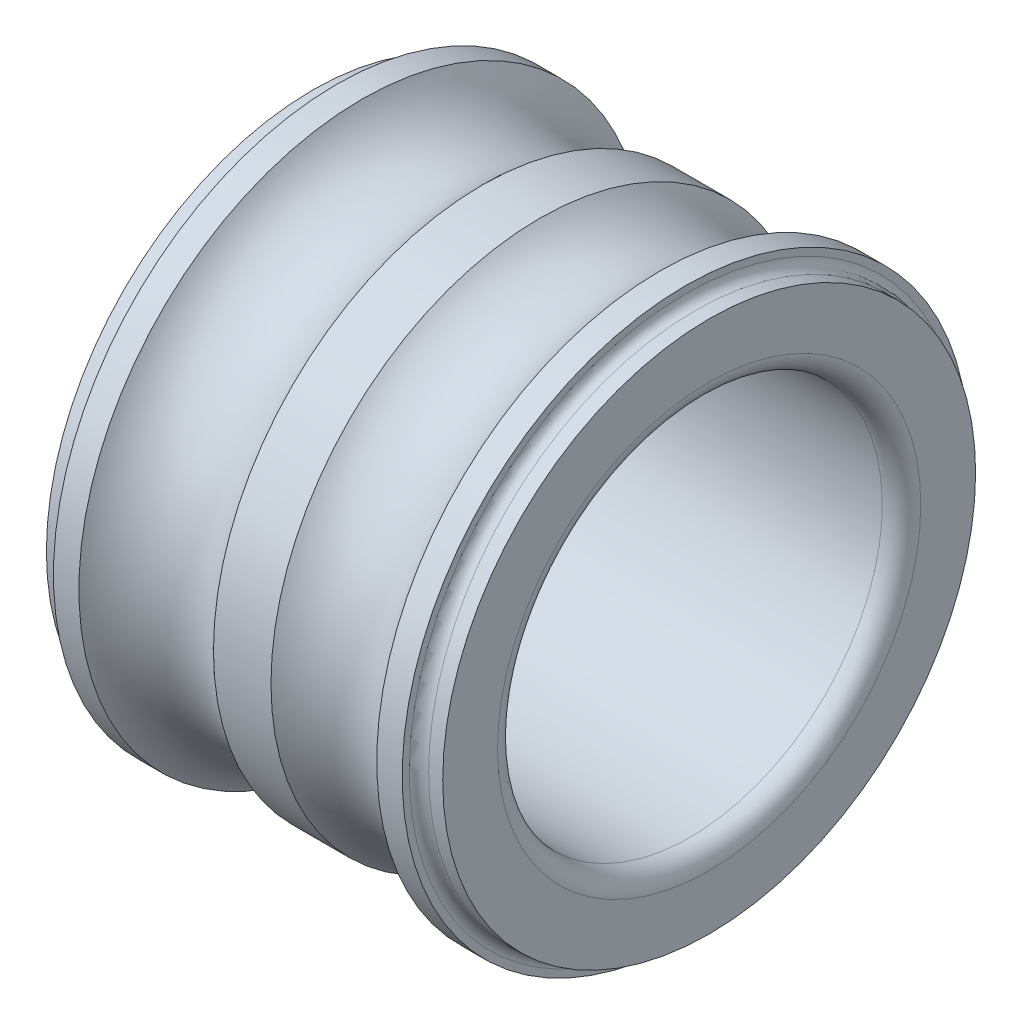
ISO-10303-21;
HEADER;
FILE_DESCRIPTION(('STEP AP214'),'2;1');
FILE_NAME('part.step','',(''),(''),'','','');
FILE_SCHEMA(('AUTOMOTIVE_DESIGN { 1 0 10303 214 1 1 1 1 }'));
ENDSEC;
DATA;
#1=APPLICATION_CONTEXT('core data for automotive mechanical design processes');
#2=APPLICATION_PROTOCOL_DEFINITION('international standard','automotive_design',2000,#1);
#3=PRODUCT_CONTEXT('',#1,'mechanical');
#4=PRODUCT('Part','Part','',(#3));
#5=PRODUCT_RELATED_PRODUCT_CATEGORY('part','',(#4));
#6=PRODUCT_DEFINITION_FORMATION('','',#4);
#7=PRODUCT_DEFINITION_CONTEXT('part definition',#1,'design');
#8=PRODUCT_DEFINITION('design','',#6,#7);
#9=PRODUCT_DEFINITION_SHAPE('','',#8);
#10=(LENGTH_UNIT() NAMED_UNIT(*) SI_UNIT(.MILLI.,.METRE.));
#11=(NAMED_UNIT(*) PLANE_ANGLE_UNIT() SI_UNIT($,.RADIAN.));
#12=(NAMED_UNIT(*) SI_UNIT($,.STERADIAN.) SOLID_ANGLE_UNIT());
#13=UNCERTAINTY_MEASURE_WITH_UNIT(LENGTH_MEASURE(1.E-05),#10,'distance_accuracy_value','');
#14=(GEOMETRIC_REPRESENTATION_CONTEXT(3) GLOBAL_UNCERTAINTY_ASSIGNED_CONTEXT((#13)) GLOBAL_UNIT_ASSIGNED_CONTEXT((#10,
#11,#12)) REPRESENTATION_CONTEXT('',''));
#15=CARTESIAN_POINT('',(0.,0.,0.));
#16=DIRECTION('',(0.,0.,1.));
#17=DIRECTION('',(1.,0.,0.));
#18=AXIS2_PLACEMENT_3D('',#15,#16,#17);
#19=CARTESIAN_POINT('',(14.6293829910738,0.,0.));
#20=DIRECTION('',(1.,0.,0.));
#21=DIRECTION('',(0.,0.,-1.));
#22=AXIS2_PLACEMENT_3D('',#19,#20,#21);
#23=TOROIDAL_SURFACE('',#22,16.75,3.969);
#24=CARTESIAN_POINT('',(11.7949500477851,0.,0.));
#25=DIRECTION('',(1.,0.,0.));
#26=DIRECTION('',(0.,1.,0.));
#27=AXIS2_PLACEMENT_3D('',#24,#25,#26);
#28=CIRCLE('',#27,13.9717);
#29=CARTESIAN_POINT('',(11.7949500477851,13.9717,0.));
#30=VERTEX_POINT('',#29);
#31=EDGE_CURVE('E11',#30,#30,#28,.T.);
#32=ORIENTED_EDGE('',*,*,#31,.T.);
#33=EDGE_LOOP('',(#32));
#34=FACE_BOUND('',#33,.T.);
#35=CARTESIAN_POINT('',(18.0399637334108,0.,0.));
#36=DIRECTION('',(1.,0.,0.));
#37=DIRECTION('',(0.,1.,0.));
#38=AXIS2_PLACEMENT_3D('',#35,#36,#37);
#39=CIRCLE('',#38,14.72);
#40=CARTESIAN_POINT('',(18.0399637334108,14.72,0.));
#41=VERTEX_POINT('',#40);
#42=EDGE_CURVE('E87',#41,#41,#39,.T.);
#43=ORIENTED_EDGE('',*,*,#42,.F.);
#44=EDGE_LOOP('',(#43));
#45=FACE_BOUND('',#44,.T.);
#46=ADVANCED_FACE('F16',(#34,#45),#23,.F.);
#47=CARTESIAN_POINT('',(10.3,0.,0.));
#48=DIRECTION('',(-1.,0.,0.));
#49=DIRECTION('',(0.,1.,0.));
#50=AXIS2_PLACEMENT_3D('',#47,#48,#49);
#51=CYLINDRICAL_SURFACE('',#50,13.9717);
#52=CARTESIAN_POINT('',(8.80504995221489,0.,0.));
#53=DIRECTION('',(1.,0.,0.));
#54=DIRECTION('',(0.,1.,0.));
#55=AXIS2_PLACEMENT_3D('',#52,#53,#54);
#56=CIRCLE('',#55,13.9717);
#57=CARTESIAN_POINT('',(8.80504995221489,13.9717,0.));
#58=VERTEX_POINT('',#57);
#59=EDGE_CURVE('E26',#58,#58,#56,.T.);
#60=ORIENTED_EDGE('',*,*,#59,.T.);
#61=EDGE_LOOP('',(#60));
#62=FACE_BOUND('',#61,.T.);
#63=ORIENTED_EDGE('',*,*,#31,.F.);
#64=EDGE_LOOP('',(#63));
#65=FACE_BOUND('',#64,.T.);
#66=ADVANCED_FACE('F109',(#62,#65),#51,.T.);
#67=CARTESIAN_POINT('',(5.97061700892623,0.,0.));
#68=DIRECTION('',(1.,0.,0.));
#69=DIRECTION('',(0.,0.,-1.));
#70=AXIS2_PLACEMENT_3D('',#67,#68,#69);
#71=TOROIDAL_SURFACE('',#70,16.75,3.969);
#72=CARTESIAN_POINT('',(2.56003626658923,0.,0.));
#73=DIRECTION('',(1.,0.,0.));
#74=DIRECTION('',(0.,1.,0.));
#75=AXIS2_PLACEMENT_3D('',#72,#73,#74);
#76=CIRCLE('',#75,14.72);
#77=CARTESIAN_POINT('',(2.56003626658923,14.72,0.));
#78=VERTEX_POINT('',#77);
#79=EDGE_CURVE('E76',#78,#78,#76,.T.);
#80=ORIENTED_EDGE('',*,*,#79,.T.);
#81=EDGE_LOOP('',(#80));
#82=FACE_BOUND('',#81,.T.);
#83=ORIENTED_EDGE('',*,*,#59,.F.);
#84=EDGE_LOOP('',(#83));
#85=FACE_BOUND('',#84,.T.);
#86=ADVANCED_FACE('F112',(#82,#85),#71,.F.);
#87=CARTESIAN_POINT('',(1.28001813329461,0.,0.));
#88=DIRECTION('',(-1.,0.,0.));
#89=DIRECTION('',(0.,1.,0.));
#90=AXIS2_PLACEMENT_3D('',#87,#88,#89);
#91=CYLINDRICAL_SURFACE('',#90,14.72);
#92=ORIENTED_EDGE('',*,*,#79,.F.);
#93=EDGE_LOOP('',(#92));
#94=FACE_BOUND('',#93,.T.);
#95=CARTESIAN_POINT('',(1.236,0.,0.));
#96=DIRECTION('',(1.,0.,0.));
#97=DIRECTION('',(0.,1.,0.));
#98=AXIS2_PLACEMENT_3D('',#95,#96,#97);
#99=CIRCLE('',#98,14.72);
#100=CARTESIAN_POINT('',(1.236,-14.72,0.));
#101=VERTEX_POINT('',#100);
#102=EDGE_CURVE('E83',#101,#101,#99,.T.);
#103=ORIENTED_EDGE('',*,*,#102,.T.);
#104=EDGE_LOOP('',(#103));
#105=FACE_BOUND('',#104,.T.);
#106=ADVANCED_FACE('F114',(#94,#105),#91,.T.);
#107=CARTESIAN_POINT('',(0.,12.86,0.));
#108=DIRECTION('',(-1.,0.,0.));
#109=DIRECTION('',(0.,-1.,0.));
#110=AXIS2_PLACEMENT_3D('',#107,#108,#109);
#111=PLANE('',#110);
#112=CARTESIAN_POINT('',(0.,0.,0.));
#113=DIRECTION('',(1.,0.,0.));
#114=DIRECTION('',(0.,1.,0.));
#115=AXIS2_PLACEMENT_3D('',#112,#113,#114);
#116=CIRCLE('',#115,11.);
#117=CARTESIAN_POINT('',(0.,11.,0.));
#118=VERTEX_POINT('',#117);
#119=EDGE_CURVE('E72',#118,#118,#116,.T.);
#120=ORIENTED_EDGE('',*,*,#119,.T.);
#121=EDGE_LOOP('',(#120));
#122=FACE_BOUND('',#121,.T.);
#123=CARTESIAN_POINT('',(0.,0.,0.));
#124=DIRECTION('',(-1.,0.,0.));
#125=DIRECTION('',(0.,1.,0.));
#126=AXIS2_PLACEMENT_3D('',#123,#124,#125);
#127=CIRCLE('',#126,13.85);
#128=CARTESIAN_POINT('',(0.,-13.85,0.));
#129=VERTEX_POINT('',#128);
#130=EDGE_CURVE('E105',#129,#129,#127,.T.);
#131=ORIENTED_EDGE('',*,*,#130,.T.);
#132=EDGE_LOOP('',(#131));
#133=FACE_BOUND('',#132,.T.);
#134=ADVANCED_FACE('F73',(#122,#133),#111,.T.);
#135=CARTESIAN_POINT('',(1.,0.,0.));
#136=DIRECTION('',(1.,0.,0.));
#137=DIRECTION('',(0.,0.,-1.));
#138=AXIS2_PLACEMENT_3D('',#135,#136,#137);
#139=TOROIDAL_SURFACE('',#138,11.,1.);
#140=CARTESIAN_POINT('',(1.,0.,0.));
#141=DIRECTION('',(1.,0.,0.));
#142=DIRECTION('',(0.,1.,0.));
#143=AXIS2_PLACEMENT_3D('',#140,#141,#142);
#144=CIRCLE('',#143,10.);
#145=CARTESIAN_POINT('',(1.,10.,0.));
#146=VERTEX_POINT('',#145);
#147=EDGE_CURVE('E77',#146,#146,#144,.T.);
#148=ORIENTED_EDGE('',*,*,#147,.T.);
#149=EDGE_LOOP('',(#148));
#150=FACE_BOUND('',#149,.T.);
#151=ORIENTED_EDGE('',*,*,#119,.F.);
#152=EDGE_LOOP('',(#151));
#153=FACE_BOUND('',#152,.T.);
#154=ADVANCED_FACE('F169',(#150,#153),#139,.T.);
#155=CARTESIAN_POINT('',(10.3,0.,0.));
#156=DIRECTION('',(-1.,0.,0.));
#157=DIRECTION('',(0.,1.,0.));
#158=AXIS2_PLACEMENT_3D('',#155,#156,#157);
#159=CYLINDRICAL_SURFACE('',#158,10.);
#160=CARTESIAN_POINT('',(19.6,0.,0.));
#161=DIRECTION('',(1.,0.,0.));
#162=DIRECTION('',(0.,1.,0.));
#163=AXIS2_PLACEMENT_3D('',#160,#161,#162);
#164=CIRCLE('',#163,10.);
#165=CARTESIAN_POINT('',(19.6,10.,0.));
#166=VERTEX_POINT('',#165);
#167=EDGE_CURVE('E80',#166,#166,#164,.T.);
#168=ORIENTED_EDGE('',*,*,#167,.T.);
#169=EDGE_LOOP('',(#168));
#170=FACE_BOUND('',#169,.T.);
#171=ORIENTED_EDGE('',*,*,#147,.F.);
#172=EDGE_LOOP('',(#171));
#173=FACE_BOUND('',#172,.T.);
#174=ADVANCED_FACE('F165',(#170,#173),#159,.F.);
#175=CARTESIAN_POINT('',(19.6,0.,0.));
#176=DIRECTION('',(1.,0.,0.));
#177=DIRECTION('',(0.,0.,-1.));
#178=AXIS2_PLACEMENT_3D('',#175,#176,#177);
#179=TOROIDAL_SURFACE('',#178,11.,1.);
#180=CARTESIAN_POINT('',(20.6,0.,0.));
#181=DIRECTION('',(1.,0.,0.));
#182=DIRECTION('',(0.,1.,0.));
#183=AXIS2_PLACEMENT_3D('',#180,#181,#182);
#184=CIRCLE('',#183,11.);
#185=CARTESIAN_POINT('',(20.6,11.,0.));
#186=VERTEX_POINT('',#185);
#187=EDGE_CURVE('E85',#186,#186,#184,.T.);
#188=ORIENTED_EDGE('',*,*,#187,.T.);
#189=EDGE_LOOP('',(#188));
#190=FACE_BOUND('',#189,.T.);
#191=ORIENTED_EDGE('',*,*,#167,.F.);
#192=EDGE_LOOP('',(#191));
#193=FACE_BOUND('',#192,.T.);
#194=ADVANCED_FACE('F144',(#190,#193),#179,.T.);
#195=CARTESIAN_POINT('',(20.6,12.86,0.));
#196=DIRECTION('',(1.,0.,0.));
#197=DIRECTION('',(0.,1.,0.));
#198=AXIS2_PLACEMENT_3D('',#195,#196,#197);
#199=PLANE('',#198);
#200=ORIENTED_EDGE('',*,*,#187,.F.);
#201=EDGE_LOOP('',(#200));
#202=FACE_BOUND('',#201,.T.);
#203=CARTESIAN_POINT('',(20.6,0.,0.));
#204=DIRECTION('',(1.,0.,0.));
#205=DIRECTION('',(0.,1.,0.));
#206=AXIS2_PLACEMENT_3D('',#203,#204,#205);
#207=CIRCLE('',#206,13.85);
#208=CARTESIAN_POINT('',(20.6,-13.85,0.));
#209=VERTEX_POINT('',#208);
#210=EDGE_CURVE('E102',#209,#209,#207,.T.);
#211=ORIENTED_EDGE('',*,*,#210,.T.);
#212=EDGE_LOOP('',(#211));
#213=FACE_BOUND('',#212,.T.);
#214=ADVANCED_FACE('F136',(#202,#213),#199,.T.);
#215=CARTESIAN_POINT('',(19.3199818667054,0.,0.));
#216=DIRECTION('',(-1.,0.,0.));
#217=DIRECTION('',(0.,1.,0.));
#218=AXIS2_PLACEMENT_3D('',#215,#216,#217);
#219=CYLINDRICAL_SURFACE('',#218,14.72);
#220=ORIENTED_EDGE('',*,*,#42,.T.);
#221=EDGE_LOOP('',(#220));
#222=FACE_BOUND('',#221,.T.);
#223=CARTESIAN_POINT('',(19.364,0.,0.));
#224=DIRECTION('',(-1.,0.,0.));
#225=DIRECTION('',(0.,1.,0.));
#226=AXIS2_PLACEMENT_3D('',#223,#224,#225);
#227=CIRCLE('',#226,14.72);
#228=CARTESIAN_POINT('',(19.364,-14.72,0.));
#229=VERTEX_POINT('',#228);
#230=EDGE_CURVE('E98',#229,#229,#227,.T.);
#231=ORIENTED_EDGE('',*,*,#230,.T.);
#232=EDGE_LOOP('',(#231));
#233=FACE_BOUND('',#232,.T.);
#234=ADVANCED_FACE('F133',(#222,#233),#219,.T.);
#235=CARTESIAN_POINT('',(0.7314,0.,0.));
#236=DIRECTION('',(1.,0.,0.));
#237=DIRECTION('',(0.,0.,-1.));
#238=AXIS2_PLACEMENT_3D('',#235,#236,#237);
#239=TOROIDAL_SURFACE('',#238,14.3546,0.5046);
#240=CARTESIAN_POINT('',(1.236,0.,0.));
#241=DIRECTION('',(1.,0.,0.));
#242=DIRECTION('',(0.,1.,0.));
#243=AXIS2_PLACEMENT_3D('',#240,#241,#242);
#244=CIRCLE('',#243,14.3546);
#245=CARTESIAN_POINT('',(1.236,14.3546,0.));
#246=VERTEX_POINT('',#245);
#247=EDGE_CURVE('E92',#246,#246,#244,.T.);
#248=ORIENTED_EDGE('',*,*,#247,.F.);
#249=EDGE_LOOP('',(#248));
#250=FACE_BOUND('',#249,.T.);
#251=CARTESIAN_POINT('',(0.7314,0.,0.));
#252=DIRECTION('',(1.,0.,0.));
#253=DIRECTION('',(0.,1.,0.));
#254=AXIS2_PLACEMENT_3D('',#251,#252,#253);
#255=CIRCLE('',#254,13.85);
#256=CARTESIAN_POINT('',(0.7314,13.85,0.));
#257=VERTEX_POINT('',#256);
#258=EDGE_CURVE('E20',#257,#257,#255,.T.);
#259=ORIENTED_EDGE('',*,*,#258,.T.);
#260=EDGE_LOOP('',(#259));
#261=FACE_BOUND('',#260,.T.);
#262=ADVANCED_FACE('F135',(#250,#261),#239,.F.);
#263=CARTESIAN_POINT('',(1.236,15.0373,0.));
#264=DIRECTION('',(1.,0.,0.));
#265=DIRECTION('',(0.,1.,0.));
#266=AXIS2_PLACEMENT_3D('',#263,#264,#265);
#267=PLANE('',#266);
#268=ORIENTED_EDGE('',*,*,#247,.T.);
#269=EDGE_LOOP('',(#268));
#270=FACE_BOUND('',#269,.T.);
#271=ORIENTED_EDGE('',*,*,#102,.F.);
#272=EDGE_LOOP('',(#271));
#273=FACE_BOUND('',#272,.T.);
#274=ADVANCED_FACE('F141',(#270,#273),#267,.F.);
#275=CARTESIAN_POINT('',(-0.1343,0.,0.));
#276=DIRECTION('',(-1.,0.,0.));
#277=DIRECTION('',(0.,1.,0.));
#278=AXIS2_PLACEMENT_3D('',#275,#276,#277);
#279=CYLINDRICAL_SURFACE('',#278,13.85);
#280=ORIENTED_EDGE('',*,*,#258,.F.);
#281=EDGE_LOOP('',(#280));
#282=FACE_BOUND('',#281,.T.);
#283=ORIENTED_EDGE('',*,*,#130,.F.);
#284=EDGE_LOOP('',(#283));
#285=FACE_BOUND('',#284,.T.);
#286=ADVANCED_FACE('F18',(#282,#285),#279,.T.);
#287=CARTESIAN_POINT('',(19.8686,0.,0.));
#288=DIRECTION('',(-1.,0.,0.));
#289=DIRECTION('',(0.,0.,1.));
#290=AXIS2_PLACEMENT_3D('',#287,#288,#289);
#291=TOROIDAL_SURFACE('',#290,14.3546,0.5046);
#292=CARTESIAN_POINT('',(19.364,0.,0.));
#293=DIRECTION('',(-1.,0.,0.));
#294=DIRECTION('',(0.,1.,0.));
#295=AXIS2_PLACEMENT_3D('',#292,#293,#294);
#296=CIRCLE('',#295,14.3546);
#297=CARTESIAN_POINT('',(19.364,14.3546,0.));
#298=VERTEX_POINT('',#297);
#299=EDGE_CURVE('E99',#298,#298,#296,.T.);
#300=ORIENTED_EDGE('',*,*,#299,.F.);
#301=EDGE_LOOP('',(#300));
#302=FACE_BOUND('',#301,.T.);
#303=CARTESIAN_POINT('',(19.8686,0.,0.));
#304=DIRECTION('',(-1.,0.,0.));
#305=DIRECTION('',(0.,1.,0.));
#306=AXIS2_PLACEMENT_3D('',#303,#304,#305);
#307=CIRCLE('',#306,13.85);
#308=CARTESIAN_POINT('',(19.8686,13.85,0.));
#309=VERTEX_POINT('',#308);
#310=EDGE_CURVE('E100',#309,#309,#307,.T.);
#311=ORIENTED_EDGE('',*,*,#310,.T.);
#312=EDGE_LOOP('',(#311));
#313=FACE_BOUND('',#312,.T.);
#314=ADVANCED_FACE('F152',(#302,#313),#291,.F.);
#315=CARTESIAN_POINT('',(19.364,15.0373,0.));
#316=DIRECTION('',(-1.,0.,0.));
#317=DIRECTION('',(0.,1.,0.));
#318=AXIS2_PLACEMENT_3D('',#315,#316,#317);
#319=PLANE('',#318);
#320=ORIENTED_EDGE('',*,*,#299,.T.);
#321=EDGE_LOOP('',(#320));
#322=FACE_BOUND('',#321,.T.);
#323=ORIENTED_EDGE('',*,*,#230,.F.);
#324=EDGE_LOOP('',(#323));
#325=FACE_BOUND('',#324,.T.);
#326=ADVANCED_FACE('F149',(#322,#325),#319,.F.);
#327=CARTESIAN_POINT('',(20.7343,0.,0.));
#328=DIRECTION('',(1.,0.,0.));
#329=DIRECTION('',(0.,1.,0.));
#330=AXIS2_PLACEMENT_3D('',#327,#328,#329);
#331=CYLINDRICAL_SURFACE('',#330,13.85);
#332=ORIENTED_EDGE('',*,*,#310,.F.);
#333=EDGE_LOOP('',(#332));
#334=FACE_BOUND('',#333,.T.);
#335=ORIENTED_EDGE('',*,*,#210,.F.);
#336=EDGE_LOOP('',(#335));
#337=FACE_BOUND('',#336,.T.);
#338=ADVANCED_FACE('F151',(#334,#337),#331,.T.);
#339=CLOSED_SHELL('',(#46,#66,#86,#106,#134,#154,#174,#194,#214,#234,#262,#274,#286,#314,#326,#338));
#340=MANIFOLD_SOLID_BREP('B1',#339);
#341=ADVANCED_BREP_SHAPE_REPRESENTATION('',(#18,#340),#14);
#342=SHAPE_DEFINITION_REPRESENTATION(#9,#341);
ENDSEC;
END-ISO-10303-21;
